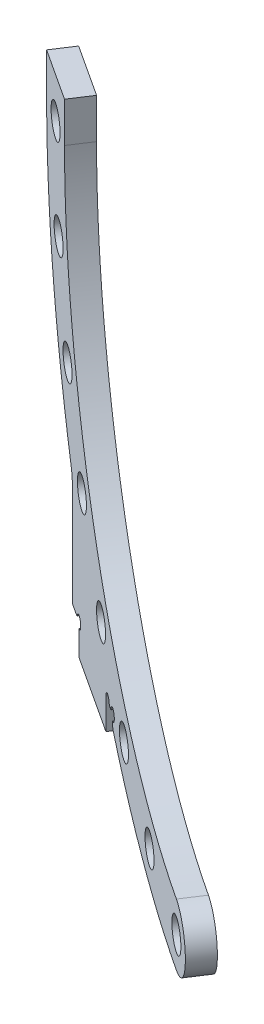
ISO-10303-21;
HEADER;
FILE_DESCRIPTION(('STEP AP214'),'2;1');
FILE_NAME('part.step','',(''),(''),'','','');
FILE_SCHEMA(('AUTOMOTIVE_DESIGN { 1 0 10303 214 1 1 1 1 }'));
ENDSEC;
DATA;
#1=APPLICATION_CONTEXT('core data for automotive mechanical design processes');
#2=APPLICATION_PROTOCOL_DEFINITION('international standard','automotive_design',2000,#1);
#3=PRODUCT_CONTEXT('',#1,'mechanical');
#4=PRODUCT('Part','Part','',(#3));
#5=PRODUCT_RELATED_PRODUCT_CATEGORY('part','',(#4));
#6=PRODUCT_DEFINITION_FORMATION('','',#4);
#7=PRODUCT_DEFINITION_CONTEXT('part definition',#1,'design');
#8=PRODUCT_DEFINITION('design','',#6,#7);
#9=PRODUCT_DEFINITION_SHAPE('','',#8);
#10=(LENGTH_UNIT() NAMED_UNIT(*) SI_UNIT(.MILLI.,.METRE.));
#11=(NAMED_UNIT(*) PLANE_ANGLE_UNIT() SI_UNIT($,.RADIAN.));
#12=(NAMED_UNIT(*) SI_UNIT($,.STERADIAN.) SOLID_ANGLE_UNIT());
#13=UNCERTAINTY_MEASURE_WITH_UNIT(LENGTH_MEASURE(1.E-05),#10,'distance_accuracy_value','');
#14=(GEOMETRIC_REPRESENTATION_CONTEXT(3) GLOBAL_UNCERTAINTY_ASSIGNED_CONTEXT((#13)) GLOBAL_UNIT_ASSIGNED_CONTEXT((#10,
#11,#12)) REPRESENTATION_CONTEXT('',''));
#15=CARTESIAN_POINT('',(0.,0.,0.));
#16=DIRECTION('',(0.,0.,1.));
#17=DIRECTION('',(1.,0.,0.));
#18=AXIS2_PLACEMENT_3D('',#15,#16,#17);
#19=CARTESIAN_POINT('',(27.833334942382,-26.,6.76462833423938));
#20=DIRECTION('',(0.547038860668516,0.,-0.837107212320197));
#21=DIRECTION('',(-0.837107212320197,0.,-0.547038860668516));
#22=AXIS2_PLACEMENT_3D('',#19,#20,#21);
#23=PLANE('',#22);
#24=CARTESIAN_POINT('',(27.833334942382,28.,6.76462833423938));
#25=DIRECTION('',(0.547038860668516,0.,-0.837107212320197));
#26=DIRECTION('',(-0.837107212320197,0.,-0.547038860668516));
#27=AXIS2_PLACEMENT_3D('',#24,#25,#26);
#28=CIRCLE('',#27,58.);
#29=CARTESIAN_POINT('',(27.833334942382,-30.,6.76462833423939));
#30=VERTEX_POINT('',#29);
#31=CARTESIAN_POINT('',(4.19051558919937,-22.6587202338135,-8.6856518349027));
#32=VERTEX_POINT('',#31);
#33=EDGE_CURVE('E214',#30,#32,#28,.T.);
#34=ORIENTED_EDGE('',*,*,#33,.T.);
#35=CARTESIAN_POINT('',(4.39433299741646,-22.2220071283496,-8.55245976447906));
#36=DIRECTION('',(0.547038860668516,0.,-0.837107212320197));
#37=DIRECTION('',(-0.837107212320197,0.,-0.547038860668516));
#38=AXIS2_PLACEMENT_3D('',#35,#36,#37);
#39=CIRCLE('',#38,0.5);
#40=CARTESIAN_POINT('',(3.97577939125636,-22.2220071283496,-8.82597919481332));
#41=VERTEX_POINT('',#40);
#42=EDGE_CURVE('E310',#32,#41,#39,.T.);
#43=ORIENTED_EDGE('',*,*,#42,.T.);
#44=DIRECTION('',(0.,1.,0.));
#45=VECTOR('',#44,1.);
#46=CARTESIAN_POINT('',(3.97577939125636,-21.,-8.82597919481332));
#47=LINE('',#46,#45);
#48=CARTESIAN_POINT('',(3.97577939125636,-21.75,-8.82597919481332));
#49=VERTEX_POINT('',#48);
#50=EDGE_CURVE('E200',#41,#49,#47,.T.);
#51=ORIENTED_EDGE('',*,*,#50,.T.);
#52=CARTESIAN_POINT('',(3.97577939125636,-21.,-8.82597919481332));
#53=DIRECTION('',(0.547038860668516,0.,-0.837107212320198));
#54=DIRECTION('',(-0.837107212320198,0.,-0.547038860668516));
#55=AXIS2_PLACEMENT_3D('',#52,#53,#54);
#56=CIRCLE('',#55,0.750000000000001);
#57=CARTESIAN_POINT('',(3.34794898201621,-21.,-9.23625834031471));
#58=VERTEX_POINT('',#57);
#59=EDGE_CURVE('E182',#58,#49,#56,.T.);
#60=ORIENTED_EDGE('',*,*,#59,.F.);
#61=DIRECTION('',(-0.837107212320198,0.,-0.547038860668515));
#62=VECTOR('',#61,1.);
#63=CARTESIAN_POINT('',(3.97577939125636,-21.,-8.82597919481332));
#64=LINE('',#63,#62);
#65=CARTESIAN_POINT('',(2.72011857277607,-21.,-9.6465374858161));
#66=VERTEX_POINT('',#65);
#67=EDGE_CURVE('E198',#58,#66,#64,.T.);
#68=ORIENTED_EDGE('',*,*,#67,.T.);
#69=CARTESIAN_POINT('',(2.09228816353592,-21.,-10.0568166313175));
#70=DIRECTION('',(0.547038860668516,0.,-0.837107212320198));
#71=DIRECTION('',(-0.837107212320198,0.,-0.547038860668516));
#72=AXIS2_PLACEMENT_3D('',#69,#70,#71);
#73=CIRCLE('',#72,0.750000000000001);
#74=CARTESIAN_POINT('',(1.46445775429577,-21.,-10.4670957768189));
#75=VERTEX_POINT('',#74);
#76=EDGE_CURVE('E202',#75,#66,#73,.T.);
#77=ORIENTED_EDGE('',*,*,#76,.F.);
#78=DIRECTION('',(0.,-1.,0.));
#79=VECTOR('',#78,1.);
#80=CARTESIAN_POINT('',(1.46445775429577,-21.,-10.4670957768189));
#81=LINE('',#80,#79);
#82=CARTESIAN_POINT('',(1.46445775429577,-25.,-10.4670957768189));
#83=VERTEX_POINT('',#82);
#84=EDGE_CURVE('E208',#75,#83,#81,.T.);
#85=ORIENTED_EDGE('',*,*,#84,.T.);
#86=DIRECTION('',(-0.837107212320198,0.,-0.547038860668516));
#87=VECTOR('',#86,1.);
#88=CARTESIAN_POINT('',(1.46445775429577,-25.,-10.4670957768189));
#89=LINE('',#88,#87);
#90=CARTESIAN_POINT('',(-8.5808287935466,-25.,-17.0315621048411));
#91=VERTEX_POINT('',#90);
#92=EDGE_CURVE('E212',#83,#91,#89,.T.);
#93=ORIENTED_EDGE('',*,*,#92,.T.);
#94=DIRECTION('',(0.,1.,0.));
#95=VECTOR('',#94,1.);
#96=CARTESIAN_POINT('',(-8.5808287935466,-25.,-17.0315621048411));
#97=LINE('',#96,#95);
#98=CARTESIAN_POINT('',(-8.5808287935466,-21.75,-17.0315621048411));
#99=VERTEX_POINT('',#98);
#100=EDGE_CURVE('E220',#91,#99,#97,.T.);
#101=ORIENTED_EDGE('',*,*,#100,.T.);
#102=CARTESIAN_POINT('',(-8.5808287935466,-21.,-17.0315621048411));
#103=DIRECTION('',(0.547038860668516,0.,-0.837107212320198));
#104=DIRECTION('',(-0.837107212320198,0.,-0.547038860668516));
#105=AXIS2_PLACEMENT_3D('',#102,#103,#104);
#106=CIRCLE('',#105,0.750000000000003);
#107=CARTESIAN_POINT('',(-9.15624486833422,-20.7,-17.4075891529054));
#108=VERTEX_POINT('',#107);
#109=EDGE_CURVE('E615',#108,#99,#106,.T.);
#110=ORIENTED_EDGE('',*,*,#109,.F.);
#111=CARTESIAN_POINT('',(-9.5398555848593,-20.5,-17.658273851615));
#112=DIRECTION('',(0.547038860668516,0.,-0.837107212320197));
#113=DIRECTION('',(-0.837107212320197,0.,-0.547038860668516));
#114=AXIS2_PLACEMENT_3D('',#111,#112,#113);
#115=CIRCLE('',#114,0.5);
#116=CARTESIAN_POINT('',(-9.5398555848593,-21.,-17.658273851615));
#117=VERTEX_POINT('',#116);
#118=EDGE_CURVE('E307',#108,#117,#115,.T.);
#119=ORIENTED_EDGE('',*,*,#118,.T.);
#120=DIRECTION('',(-0.837107212320198,0.,-0.547038860668516));
#121=VECTOR('',#120,1.);
#122=CARTESIAN_POINT('',(-8.5808287935466,-21.,-17.0315621048411));
#123=LINE('',#122,#121);
#124=CARTESIAN_POINT('',(-11.0921504305072,-21.,-18.6726786868466));
#125=VERTEX_POINT('',#124);
#126=EDGE_CURVE('E224',#117,#125,#123,.T.);
#127=ORIENTED_EDGE('',*,*,#126,.T.);
#128=DIRECTION('',(0.,1.,0.));
#129=VECTOR('',#128,1.);
#130=CARTESIAN_POINT('',(-11.0921504305072,-21.,-18.6726786868466));
#131=LINE('',#130,#129);
#132=CARTESIAN_POINT('',(-11.0921504305072,-7.64758056306205,-18.6726786868466));
#133=VERTEX_POINT('',#132);
#134=EDGE_CURVE('E227',#125,#133,#131,.T.);
#135=ORIENTED_EDGE('',*,*,#134,.T.);
#136=CARTESIAN_POINT('',(-13.6034720674678,-7.64758056306205,-20.3137952688522));
#137=DIRECTION('',(0.547038860668516,0.,-0.837107212320197));
#138=DIRECTION('',(-0.837107212320197,0.,-0.547038860668516));
#139=AXIS2_PLACEMENT_3D('',#136,#137,#138);
#140=CIRCLE('',#139,3.);
#141=CARTESIAN_POINT('',(-11.565596312885,-5.89442086323934,-18.9820695178804));
#142=VERTEX_POINT('',#141);
#143=EDGE_CURVE('E11',#133,#142,#140,.F.);
#144=ORIENTED_EDGE('',*,*,#143,.T.);
#145=CARTESIAN_POINT('',(27.833334942382,28.,6.76462833423938));
#146=DIRECTION('',(0.547038860668516,0.,-0.837107212320197));
#147=DIRECTION('',(-0.837107212320197,0.,-0.547038860668516));
#148=AXIS2_PLACEMENT_3D('',#145,#146,#147);
#149=CIRCLE('',#148,58.);
#150=CARTESIAN_POINT('',(-20.7188833721895,28.,-24.9636255845345));
#151=VERTEX_POINT('',#150);
#152=EDGE_CURVE('E230',#142,#151,#149,.T.);
#153=ORIENTED_EDGE('',*,*,#152,.T.);
#154=DIRECTION('',(0.,1.,0.));
#155=VECTOR('',#154,1.);
#156=CARTESIAN_POINT('',(-20.7188833721895,33.2,-24.9636255845345));
#157=LINE('',#156,#155);
#158=CARTESIAN_POINT('',(-20.7188833721895,33.2,-24.9636255845345));
#159=VERTEX_POINT('',#158);
#160=EDGE_CURVE('E233',#151,#159,#157,.T.);
#161=ORIENTED_EDGE('',*,*,#160,.T.);
#162=DIRECTION('',(0.837107212320197,0.,0.547038860668516));
#163=VECTOR('',#162,1.);
#164=CARTESIAN_POINT('',(-14.0220256736279,33.2,-20.5873146991864));
#165=LINE('',#164,#163);
#166=CARTESIAN_POINT('',(-14.0220256736279,33.2,-20.5873146991864));
#167=VERTEX_POINT('',#166);
#168=EDGE_CURVE('E236',#159,#167,#165,.T.);
#169=ORIENTED_EDGE('',*,*,#168,.T.);
#170=DIRECTION('',(0.,-1.,0.));
#171=VECTOR('',#170,1.);
#172=CARTESIAN_POINT('',(-14.0220256736279,28.,-20.5873146991864));
#173=LINE('',#172,#171);
#174=CARTESIAN_POINT('',(-14.0220256736279,28.,-20.5873146991864));
#175=VERTEX_POINT('',#174);
#176=EDGE_CURVE('E239',#167,#175,#173,.T.);
#177=ORIENTED_EDGE('',*,*,#176,.T.);
#178=CARTESIAN_POINT('',(27.833334942382,28.,6.76462833423938));
#179=DIRECTION('',(-0.547038860668516,0.,0.837107212320197));
#180=DIRECTION('',(0.837107212320197,0.,0.547038860668516));
#181=AXIS2_PLACEMENT_3D('',#178,#179,#180);
#182=CIRCLE('',#181,50.);
#183=CARTESIAN_POINT('',(27.833334942382,-22.,6.76462833423938));
#184=VERTEX_POINT('',#183);
#185=EDGE_CURVE('E242',#175,#184,#182,.T.);
#186=ORIENTED_EDGE('',*,*,#185,.T.);
#187=CARTESIAN_POINT('',(27.833334942382,-26.,6.76462833423938));
#188=DIRECTION('',(0.547038860668516,0.,-0.837107212320197));
#189=DIRECTION('',(-0.837107212320197,0.,-0.547038860668516));
#190=AXIS2_PLACEMENT_3D('',#187,#188,#189);
#191=CIRCLE('',#190,4.);
#192=EDGE_CURVE('E394',#184,#30,#191,.T.);
#193=ORIENTED_EDGE('',*,*,#192,.T.);
#194=EDGE_LOOP('',(#34,#43,#51,#60,#68,#77,#85,#93,#101,#110,#119,#127,#135,#144,#153,#161,#169,
#177,#186,#193));
#195=FACE_BOUND('',#194,.T.);
#196=CARTESIAN_POINT('',(17.7745454922009,-24.6461072578185,0.191338032176145));
#197=DIRECTION('',(0.547038860668516,0.,-0.837107212320197));
#198=DIRECTION('',(-0.837107212320197,0.,-0.547038860668516));
#199=AXIS2_PLACEMENT_3D('',#196,#197,#198);
#200=CIRCLE('',#199,2.);
#201=CARTESIAN_POINT('',(16.1003310675605,-24.6461072578185,-0.902739689160889));
#202=VERTEX_POINT('',#201);
#203=EDGE_CURVE('E366',#202,#202,#200,.T.);
#204=ORIENTED_EDGE('',*,*,#203,.F.);
#205=EDGE_LOOP('',(#204));
#206=FACE_BOUND('',#205,.T.);
#207=CARTESIAN_POINT('',(-0.350766794595995,-14.2189000532736,-11.6533218115116));
#208=DIRECTION('',(0.547038860668516,0.,-0.837107212320197));
#209=DIRECTION('',(-0.837107212320197,0.,-0.547038860668516));
#210=AXIS2_PLACEMENT_3D('',#207,#208,#209);
#211=CIRCLE('',#210,2.);
#212=CARTESIAN_POINT('',(-2.02498121923639,-14.2189000532736,-12.7473995328486));
#213=VERTEX_POINT('',#212);
#214=EDGE_CURVE('E374',#213,#213,#211,.T.);
#215=ORIENTED_EDGE('',*,*,#214,.F.);
#216=EDGE_LOOP('',(#215));
#217=FACE_BOUND('',#216,.T.);
#218=CARTESIAN_POINT('',(-12.8938720770602,4.57027808765185,-19.8500807474983));
#219=DIRECTION('',(0.547038860668516,0.,-0.837107212320197));
#220=DIRECTION('',(-0.837107212320197,0.,-0.547038860668516));
#221=AXIS2_PLACEMENT_3D('',#218,#219,#220);
#222=CIRCLE('',#221,2.00000000000001);
#223=CARTESIAN_POINT('',(-14.5680865017006,4.57027808765185,-20.9441584688353));
#224=VERTEX_POINT('',#223);
#225=EDGE_CURVE('E382',#224,#224,#222,.T.);
#226=ORIENTED_EDGE('',*,*,#225,.F.);
#227=EDGE_LOOP('',(#226));
#228=FACE_BOUND('',#227,.T.);
#229=CARTESIAN_POINT('',(-17.3704545229087,28.,-22.7754701418605));
#230=DIRECTION('',(0.547038860668516,0.,-0.837107212320197));
#231=DIRECTION('',(-0.837107212320197,0.,-0.547038860668516));
#232=AXIS2_PLACEMENT_3D('',#229,#230,#231);
#233=CIRCLE('',#232,2.);
#234=CARTESIAN_POINT('',(-19.0446689475491,28.,-23.8695478631975));
#235=VERTEX_POINT('',#234);
#236=EDGE_CURVE('E390',#235,#235,#233,.T.);
#237=ORIENTED_EDGE('',*,*,#236,.F.);
#238=EDGE_LOOP('',(#237));
#239=FACE_BOUND('',#238,.T.);
#240=CARTESIAN_POINT('',(-16.2371011437205,15.983869566359,-22.0348381987101));
#241=DIRECTION('',(0.547038860668516,0.,-0.837107212320197));
#242=DIRECTION('',(-0.837107212320197,0.,-0.547038860668516));
#243=AXIS2_PLACEMENT_3D('',#240,#241,#242);
#244=CIRCLE('',#243,2.);
#245=CARTESIAN_POINT('',(-17.9113155683609,15.983869566359,-23.1289159200472));
#246=VERTEX_POINT('',#245);
#247=EDGE_CURVE('E386',#246,#246,#244,.T.);
#248=ORIENTED_EDGE('',*,*,#247,.F.);
#249=EDGE_LOOP('',(#248));
#250=FACE_BOUND('',#249,.T.);
#251=CARTESIAN_POINT('',(-7.50841078843891,-5.66844930037162,-16.3307506495814));
#252=DIRECTION('',(0.547038860668516,0.,-0.837107212320197));
#253=DIRECTION('',(-0.837107212320197,0.,-0.547038860668516));
#254=AXIS2_PLACEMENT_3D('',#251,#252,#253);
#255=CIRCLE('',#254,2.00000000000001);
#256=CARTESIAN_POINT('',(-9.18262521307932,-5.66844930037162,-17.4248283709184));
#257=VERTEX_POINT('',#256);
#258=EDGE_CURVE('E378',#257,#257,#255,.T.);
#259=ORIENTED_EDGE('',*,*,#258,.F.);
#260=EDGE_LOOP('',(#259));
#261=FACE_BOUND('',#260,.T.);
#262=CARTESIAN_POINT('',(8.22014574689879,-20.6523188667306,-6.0523400464717));
#263=DIRECTION('',(0.547038860668516,0.,-0.837107212320197));
#264=DIRECTION('',(-0.837107212320197,0.,-0.547038860668516));
#265=AXIS2_PLACEMENT_3D('',#262,#263,#264);
#266=CIRCLE('',#265,2.);
#267=CARTESIAN_POINT('',(6.54593132225839,-20.6523188667306,-7.14641776780874));
#268=VERTEX_POINT('',#267);
#269=EDGE_CURVE('E370',#268,#268,#266,.T.);
#270=ORIENTED_EDGE('',*,*,#269,.F.);
#271=EDGE_LOOP('',(#270));
#272=FACE_BOUND('',#271,.T.);
#273=CARTESIAN_POINT('',(27.833334942382,-26.,6.76462833423938));
#274=DIRECTION('',(0.547038860668516,0.,-0.837107212320197));
#275=DIRECTION('',(-0.837107212320197,0.,-0.547038860668516));
#276=AXIS2_PLACEMENT_3D('',#273,#274,#275);
#277=CIRCLE('',#276,2.);
#278=CARTESIAN_POINT('',(26.1591205177416,-26.,5.67055061290235));
#279=VERTEX_POINT('',#278);
#280=EDGE_CURVE('E362',#279,#279,#277,.T.);
#281=ORIENTED_EDGE('',*,*,#280,.F.);
#282=EDGE_LOOP('',(#281));
#283=FACE_BOUND('',#282,.T.);
#284=ADVANCED_FACE('F40',(#195,#206,#217,#228,#239,#250,#261,#272,#283),#23,.T.);
#285=CARTESIAN_POINT('',(27.833334942382,-26.,6.76462833423938));
#286=DIRECTION('',(-0.547038860668516,0.,0.837107212320197));
#287=DIRECTION('',(0.837107212320197,0.,0.547038860668516));
#288=AXIS2_PLACEMENT_3D('',#285,#286,#287);
#289=CYLINDRICAL_SURFACE('',#288,4.);
#290=DIRECTION('',(-0.547038860668516,0.,0.837107212320197));
#291=VECTOR('',#290,1.);
#292=CARTESIAN_POINT('',(27.833334942382,-22.,6.76462833423938));
#293=LINE('',#292,#291);
#294=CARTESIAN_POINT('',(26.1922183603764,-22.,9.27594997119997));
#295=VERTEX_POINT('',#294);
#296=EDGE_CURVE('E245',#184,#295,#293,.T.);
#297=ORIENTED_EDGE('',*,*,#296,.T.);
#298=CARTESIAN_POINT('',(26.1922183603764,-26.,9.27594997119997));
#299=DIRECTION('',(0.547038860668516,0.,-0.837107212320197));
#300=DIRECTION('',(-0.837107212320197,0.,-0.547038860668516));
#301=AXIS2_PLACEMENT_3D('',#298,#299,#300);
#302=CIRCLE('',#301,4.);
#303=CARTESIAN_POINT('',(26.1922183603765,-30.,9.27594997119998));
#304=VERTEX_POINT('',#303);
#305=EDGE_CURVE('E418',#295,#304,#302,.T.);
#306=ORIENTED_EDGE('',*,*,#305,.T.);
#307=DIRECTION('',(-0.547038860668516,0.,0.837107212320197));
#308=VECTOR('',#307,1.);
#309=CARTESIAN_POINT('',(27.833334942382,-30.,6.76462833423939));
#310=LINE('',#309,#308);
#311=EDGE_CURVE('E281',#30,#304,#310,.T.);
#312=ORIENTED_EDGE('',*,*,#311,.F.);
#313=ORIENTED_EDGE('',*,*,#192,.F.);
#314=EDGE_LOOP('',(#297,#306,#312,#313));
#315=FACE_BOUND('',#314,.T.);
#316=ADVANCED_FACE('F447',(#315),#289,.T.);
#317=CARTESIAN_POINT('',(27.833334942382,28.,6.76462833423938));
#318=DIRECTION('',(-0.547038860668516,0.,0.837107212320197));
#319=DIRECTION('',(0.837107212320197,0.,0.547038860668516));
#320=AXIS2_PLACEMENT_3D('',#317,#318,#319);
#321=CYLINDRICAL_SURFACE('',#320,58.);
#322=CARTESIAN_POINT('',(26.1922183603764,28.,9.27594997119997));
#323=DIRECTION('',(0.547038860668516,0.,-0.837107212320197));
#324=DIRECTION('',(-0.837107212320197,0.,-0.547038860668516));
#325=AXIS2_PLACEMENT_3D('',#322,#323,#324);
#326=CIRCLE('',#325,58.);
#327=CARTESIAN_POINT('',(2.54939900719382,-22.6587202338135,-6.1743301979421));
#328=VERTEX_POINT('',#327);
#329=EDGE_CURVE('E412',#304,#328,#326,.T.);
#330=ORIENTED_EDGE('',*,*,#329,.T.);
#331=DIRECTION('',(-0.547038860668516,0.,0.837107212320197));
#332=VECTOR('',#331,1.);
#333=CARTESIAN_POINT('',(4.19051558919937,-22.6587202338135,-8.6856518349027));
#334=LINE('',#333,#332);
#335=EDGE_CURVE('E304',#328,#32,#334,.F.);
#336=ORIENTED_EDGE('',*,*,#335,.T.);
#337=ORIENTED_EDGE('',*,*,#33,.F.);
#338=ORIENTED_EDGE('',*,*,#311,.T.);
#339=EDGE_LOOP('',(#330,#336,#337,#338));
#340=FACE_BOUND('',#339,.T.);
#341=ADVANCED_FACE('F454',(#340),#321,.T.);
#342=CARTESIAN_POINT('',(3.97577939125636,-21.,-8.82597919481332));
#343=DIRECTION('',(0.837107212320197,0.,0.547038860668516));
#344=DIRECTION('',(0.547038860668516,0.,-0.837107212320197));
#345=AXIS2_PLACEMENT_3D('',#342,#343,#344);
#346=PLANE('',#345);
#347=ORIENTED_EDGE('',*,*,#50,.F.);
#348=DIRECTION('',(-0.547038860668516,0.,0.837107212320197));
#349=VECTOR('',#348,1.);
#350=CARTESIAN_POINT('',(3.97577939125636,-22.2220071283496,-8.82597919481332));
#351=LINE('',#350,#349);
#352=CARTESIAN_POINT('',(2.33466280925081,-22.2220071283496,-6.31465755785273));
#353=VERTEX_POINT('',#352);
#354=EDGE_CURVE('E294',#41,#353,#351,.T.);
#355=ORIENTED_EDGE('',*,*,#354,.T.);
#356=DIRECTION('',(0.,1.,0.));
#357=VECTOR('',#356,1.);
#358=CARTESIAN_POINT('',(2.33466280925081,-21.,-6.31465755785273));
#359=LINE('',#358,#357);
#360=CARTESIAN_POINT('',(2.33466280925081,-21.75,-6.31465755785273));
#361=VERTEX_POINT('',#360);
#362=EDGE_CURVE('E408',#353,#361,#359,.T.);
#363=ORIENTED_EDGE('',*,*,#362,.T.);
#364=DIRECTION('',(0.547038860668516,0.,-0.837107212320197));
#365=VECTOR('',#364,1.);
#366=CARTESIAN_POINT('',(-13.1966844882427,-21.75,17.4522149160573));
#367=LINE('',#366,#365);
#368=EDGE_CURVE('E191',#361,#49,#367,.T.);
#369=ORIENTED_EDGE('',*,*,#368,.T.);
#370=EDGE_LOOP('',(#347,#355,#363,#369));
#371=FACE_BOUND('',#370,.T.);
#372=ADVANCED_FACE('F407',(#371),#346,.F.);
#373=CARTESIAN_POINT('',(3.97577939125636,-21.,-8.82597919481332));
#374=DIRECTION('',(0.,1.,0.));
#375=DIRECTION('',(-1.,0.,0.));
#376=AXIS2_PLACEMENT_3D('',#373,#374,#375);
#377=PLANE('',#376);
#378=DIRECTION('',(-0.837107212320198,0.,-0.547038860668515));
#379=VECTOR('',#378,1.);
#380=CARTESIAN_POINT('',(2.33466280925081,-21.,-6.31465755785273));
#381=LINE('',#380,#379);
#382=CARTESIAN_POINT('',(1.70683240001066,-21.,-6.72493670335412));
#383=VERTEX_POINT('',#382);
#384=CARTESIAN_POINT('',(1.07900199077052,-21.,-7.1352158488555));
#385=VERTEX_POINT('',#384);
#386=EDGE_CURVE('E411',#383,#385,#381,.T.);
#387=ORIENTED_EDGE('',*,*,#386,.T.);
#388=DIRECTION('',(0.547038860668516,0.,-0.837107212320197));
#389=VECTOR('',#388,1.);
#390=CARTESIAN_POINT('',(-14.452345306723,-21.,16.6316566250545));
#391=LINE('',#390,#389);
#392=EDGE_CURVE('E206',#385,#66,#391,.T.);
#393=ORIENTED_EDGE('',*,*,#392,.T.);
#394=ORIENTED_EDGE('',*,*,#67,.F.);
#395=DIRECTION('',(0.547038860668516,0.,-0.837107212320197));
#396=VECTOR('',#395,1.);
#397=CARTESIAN_POINT('',(-13.8245148974829,-21.,17.0419357705559));
#398=LINE('',#397,#396);
#399=EDGE_CURVE('E178',#58,#383,#398,.F.);
#400=ORIENTED_EDGE('',*,*,#399,.T.);
#401=EDGE_LOOP('',(#387,#393,#394,#400));
#402=FACE_BOUND('',#401,.T.);
#403=ADVANCED_FACE('F205',(#402),#377,.F.);
#404=CARTESIAN_POINT('',(1.46445775429577,-21.,-10.4670957768189));
#405=DIRECTION('',(-0.837107212320197,0.,-0.547038860668516));
#406=DIRECTION('',(-0.547038860668516,0.,0.837107212320197));
#407=AXIS2_PLACEMENT_3D('',#404,#405,#406);
#408=PLANE('',#407);
#409=DIRECTION('',(-0.547038860668516,0.,0.837107212320197));
#410=VECTOR('',#409,1.);
#411=CARTESIAN_POINT('',(1.46445775429577,-21.,-10.4670957768189));
#412=LINE('',#411,#410);
#413=CARTESIAN_POINT('',(-0.17665882770978,-21.,-7.95577413985828));
#414=VERTEX_POINT('',#413);
#415=EDGE_CURVE('E277',#75,#414,#412,.T.);
#416=ORIENTED_EDGE('',*,*,#415,.T.);
#417=DIRECTION('',(0.,-1.,0.));
#418=VECTOR('',#417,1.);
#419=CARTESIAN_POINT('',(-0.176658827709779,-21.,-7.95577413985828));
#420=LINE('',#419,#418);
#421=CARTESIAN_POINT('',(-0.176658827709776,-25.,-7.95577413985827));
#422=VERTEX_POINT('',#421);
#423=EDGE_CURVE('E416',#414,#422,#420,.T.);
#424=ORIENTED_EDGE('',*,*,#423,.T.);
#425=DIRECTION('',(-0.547038860668516,0.,0.837107212320197));
#426=VECTOR('',#425,1.);
#427=CARTESIAN_POINT('',(1.46445775429577,-25.,-10.4670957768189));
#428=LINE('',#427,#426);
#429=EDGE_CURVE('E273',#83,#422,#428,.T.);
#430=ORIENTED_EDGE('',*,*,#429,.F.);
#431=ORIENTED_EDGE('',*,*,#84,.F.);
#432=EDGE_LOOP('',(#416,#424,#430,#431));
#433=FACE_BOUND('',#432,.T.);
#434=ADVANCED_FACE('F489',(#433),#408,.F.);
#435=CARTESIAN_POINT('',(1.46445775429577,-25.,-10.4670957768189));
#436=DIRECTION('',(0.,1.,0.));
#437=DIRECTION('',(0.,0.,1.));
#438=AXIS2_PLACEMENT_3D('',#435,#436,#437);
#439=PLANE('',#438);
#440=ORIENTED_EDGE('',*,*,#429,.T.);
#441=DIRECTION('',(-0.837107212320198,0.,-0.547038860668516));
#442=VECTOR('',#441,1.);
#443=CARTESIAN_POINT('',(-0.176658827709776,-25.,-7.95577413985827));
#444=LINE('',#443,#442);
#445=CARTESIAN_POINT('',(-10.2219453755521,-25.,-14.5202404678805));
#446=VERTEX_POINT('',#445);
#447=EDGE_CURVE('E425',#422,#446,#444,.T.);
#448=ORIENTED_EDGE('',*,*,#447,.T.);
#449=DIRECTION('',(-0.547038860668516,0.,0.837107212320197));
#450=VECTOR('',#449,1.);
#451=CARTESIAN_POINT('',(-8.5808287935466,-25.,-17.0315621048411));
#452=LINE('',#451,#450);
#453=EDGE_CURVE('E269',#91,#446,#452,.T.);
#454=ORIENTED_EDGE('',*,*,#453,.F.);
#455=ORIENTED_EDGE('',*,*,#92,.F.);
#456=EDGE_LOOP('',(#440,#448,#454,#455));
#457=FACE_BOUND('',#456,.T.);
#458=ADVANCED_FACE('F485',(#457),#439,.F.);
#459=CARTESIAN_POINT('',(-8.5808287935466,-25.,-17.0315621048411));
#460=DIRECTION('',(0.837107212320197,0.,0.547038860668516));
#461=DIRECTION('',(0.547038860668516,0.,-0.837107212320197));
#462=AXIS2_PLACEMENT_3D('',#459,#460,#461);
#463=PLANE('',#462);
#464=DIRECTION('',(0.,1.,0.));
#465=VECTOR('',#464,1.);
#466=CARTESIAN_POINT('',(-10.2219453755521,-25.,-14.5202404678805));
#467=LINE('',#466,#465);
#468=CARTESIAN_POINT('',(-10.2219453755521,-21.75,-14.5202404678805));
#469=VERTEX_POINT('',#468);
#470=EDGE_CURVE('E429',#446,#469,#467,.T.);
#471=ORIENTED_EDGE('',*,*,#470,.T.);
#472=DIRECTION('',(0.547038860668516,0.,-0.837107212320197));
#473=VECTOR('',#472,1.);
#474=CARTESIAN_POINT('',(-25.7532926730457,-21.75,9.24663200602958));
#475=LINE('',#474,#473);
#476=EDGE_CURVE('E607',#469,#99,#475,.T.);
#477=ORIENTED_EDGE('',*,*,#476,.T.);
#478=ORIENTED_EDGE('',*,*,#100,.F.);
#479=ORIENTED_EDGE('',*,*,#453,.T.);
#480=EDGE_LOOP('',(#471,#477,#478,#479));
#481=FACE_BOUND('',#480,.T.);
#482=ADVANCED_FACE('F482',(#481),#463,.F.);
#483=CARTESIAN_POINT('',(-8.5808287935466,-21.,-17.0315621048411));
#484=DIRECTION('',(0.,1.,0.));
#485=DIRECTION('',(0.,0.,1.));
#486=AXIS2_PLACEMENT_3D('',#483,#484,#485);
#487=PLANE('',#486);
#488=ORIENTED_EDGE('',*,*,#126,.F.);
#489=DIRECTION('',(0.547038860668516,0.,-0.837107212320197));
#490=VECTOR('',#489,1.);
#491=CARTESIAN_POINT('',(-9.5398555848593,-21.,-17.658273851615));
#492=LINE('',#491,#490);
#493=CARTESIAN_POINT('',(-11.1809721668648,-21.,-15.1469522146544));
#494=VERTEX_POINT('',#493);
#495=EDGE_CURVE('E313',#117,#494,#492,.F.);
#496=ORIENTED_EDGE('',*,*,#495,.T.);
#497=DIRECTION('',(-0.837107212320198,0.,-0.547038860668516));
#498=VECTOR('',#497,1.);
#499=CARTESIAN_POINT('',(-10.2219453755521,-21.,-14.5202404678805));
#500=LINE('',#499,#498);
#501=CARTESIAN_POINT('',(-12.7332670125127,-21.,-16.161357049886));
#502=VERTEX_POINT('',#501);
#503=EDGE_CURVE('E347',#494,#502,#500,.T.);
#504=ORIENTED_EDGE('',*,*,#503,.T.);
#505=DIRECTION('',(-0.547038860668516,0.,0.837107212320197));
#506=VECTOR('',#505,1.);
#507=CARTESIAN_POINT('',(-11.0921504305072,-21.,-18.6726786868466));
#508=LINE('',#507,#506);
#509=EDGE_CURVE('E265',#125,#502,#508,.T.);
#510=ORIENTED_EDGE('',*,*,#509,.F.);
#511=EDGE_LOOP('',(#488,#496,#504,#510));
#512=FACE_BOUND('',#511,.T.);
#513=ADVANCED_FACE('F437',(#512),#487,.F.);
#514=CARTESIAN_POINT('',(-11.0921504305072,-21.,-18.6726786868466));
#515=DIRECTION('',(0.837107212320197,0.,0.547038860668516));
#516=DIRECTION('',(0.547038860668516,0.,-0.837107212320197));
#517=AXIS2_PLACEMENT_3D('',#514,#515,#516);
#518=PLANE('',#517);
#519=DIRECTION('',(0.,1.,0.));
#520=VECTOR('',#519,1.);
#521=CARTESIAN_POINT('',(-12.7332670125127,-21.,-16.161357049886));
#522=LINE('',#521,#520);
#523=CARTESIAN_POINT('',(-12.7332670125127,-7.64758056306205,-16.161357049886));
#524=VERTEX_POINT('',#523);
#525=EDGE_CURVE('E341',#502,#524,#522,.T.);
#526=ORIENTED_EDGE('',*,*,#525,.T.);
#527=DIRECTION('',(0.547038860668516,0.,-0.837107212320197));
#528=VECTOR('',#527,1.);
#529=CARTESIAN_POINT('',(-11.0921504305072,-7.64758056306205,-18.6726786868466));
#530=LINE('',#529,#528);
#531=EDGE_CURVE('E56',#524,#133,#530,.T.);
#532=ORIENTED_EDGE('',*,*,#531,.T.);
#533=ORIENTED_EDGE('',*,*,#134,.F.);
#534=ORIENTED_EDGE('',*,*,#509,.T.);
#535=EDGE_LOOP('',(#526,#532,#533,#534));
#536=FACE_BOUND('',#535,.T.);
#537=ADVANCED_FACE('F439',(#536),#518,.F.);
#538=CARTESIAN_POINT('',(27.833334942382,28.,6.76462833423938));
#539=DIRECTION('',(-0.547038860668516,0.,0.837107212320197));
#540=DIRECTION('',(0.837107212320197,0.,0.547038860668516));
#541=AXIS2_PLACEMENT_3D('',#538,#539,#540);
#542=CYLINDRICAL_SURFACE('',#541,58.);
#543=ORIENTED_EDGE('',*,*,#152,.F.);
#544=DIRECTION('',(-0.547038860668516,0.,0.837107212320197));
#545=VECTOR('',#544,1.);
#546=CARTESIAN_POINT('',(-11.565596312885,-5.89442086323934,-18.9820695178804));
#547=LINE('',#546,#545);
#548=CARTESIAN_POINT('',(-13.2067128948906,-5.89442086323933,-16.4707478809198));
#549=VERTEX_POINT('',#548);
#550=EDGE_CURVE('E320',#142,#549,#547,.T.);
#551=ORIENTED_EDGE('',*,*,#550,.T.);
#552=CARTESIAN_POINT('',(26.1922183603764,28.,9.27594997119997));
#553=DIRECTION('',(0.547038860668516,0.,-0.837107212320197));
#554=DIRECTION('',(-0.837107212320197,0.,-0.547038860668516));
#555=AXIS2_PLACEMENT_3D('',#552,#553,#554);
#556=CIRCLE('',#555,58.);
#557=CARTESIAN_POINT('',(-22.359999954195,28.,-22.4523039475739));
#558=VERTEX_POINT('',#557);
#559=EDGE_CURVE('E331',#549,#558,#556,.T.);
#560=ORIENTED_EDGE('',*,*,#559,.T.);
#561=DIRECTION('',(-0.547038860668516,0.,0.837107212320197));
#562=VECTOR('',#561,1.);
#563=CARTESIAN_POINT('',(-20.7188833721895,28.,-24.9636255845345));
#564=LINE('',#563,#562);
#565=EDGE_CURVE('E261',#151,#558,#564,.T.);
#566=ORIENTED_EDGE('',*,*,#565,.F.);
#567=EDGE_LOOP('',(#543,#551,#560,#566));
#568=FACE_BOUND('',#567,.T.);
#569=ADVANCED_FACE('F329',(#568),#542,.T.);
#570=CARTESIAN_POINT('',(-20.7188833721895,33.2,-24.9636255845345));
#571=DIRECTION('',(0.837107212320197,0.,0.547038860668516));
#572=DIRECTION('',(0.547038860668516,0.,-0.837107212320197));
#573=AXIS2_PLACEMENT_3D('',#570,#571,#572);
#574=PLANE('',#573);
#575=ORIENTED_EDGE('',*,*,#565,.T.);
#576=DIRECTION('',(0.,1.,0.));
#577=VECTOR('',#576,1.);
#578=CARTESIAN_POINT('',(-22.359999954195,33.2,-22.4523039475739));
#579=LINE('',#578,#577);
#580=CARTESIAN_POINT('',(-22.359999954195,33.2,-22.4523039475739));
#581=VERTEX_POINT('',#580);
#582=EDGE_CURVE('E339',#558,#581,#579,.T.);
#583=ORIENTED_EDGE('',*,*,#582,.T.);
#584=DIRECTION('',(-0.547038860668516,0.,0.837107212320197));
#585=VECTOR('',#584,1.);
#586=CARTESIAN_POINT('',(-20.7188833721895,33.2,-24.9636255845345));
#587=LINE('',#586,#585);
#588=EDGE_CURVE('E257',#159,#581,#587,.T.);
#589=ORIENTED_EDGE('',*,*,#588,.F.);
#590=ORIENTED_EDGE('',*,*,#160,.F.);
#591=EDGE_LOOP('',(#575,#583,#589,#590));
#592=FACE_BOUND('',#591,.T.);
#593=ADVANCED_FACE('F472',(#592),#574,.F.);
#594=CARTESIAN_POINT('',(-14.0220256736279,33.2,-20.5873146991864));
#595=DIRECTION('',(0.,-1.,0.));
#596=DIRECTION('',(0.,0.,-1.));
#597=AXIS2_PLACEMENT_3D('',#594,#595,#596);
#598=PLANE('',#597);
#599=ORIENTED_EDGE('',*,*,#588,.T.);
#600=DIRECTION('',(0.837107212320197,0.,0.547038860668516));
#601=VECTOR('',#600,1.);
#602=CARTESIAN_POINT('',(-15.6631422556334,33.2,-18.0759930622258));
#603=LINE('',#602,#601);
#604=CARTESIAN_POINT('',(-15.6631422556334,33.2,-18.0759930622258));
#605=VERTEX_POINT('',#604);
#606=EDGE_CURVE('E345',#581,#605,#603,.T.);
#607=ORIENTED_EDGE('',*,*,#606,.T.);
#608=DIRECTION('',(-0.547038860668516,0.,0.837107212320197));
#609=VECTOR('',#608,1.);
#610=CARTESIAN_POINT('',(-14.0220256736279,33.2,-20.5873146991864));
#611=LINE('',#610,#609);
#612=EDGE_CURVE('E253',#167,#605,#611,.T.);
#613=ORIENTED_EDGE('',*,*,#612,.F.);
#614=ORIENTED_EDGE('',*,*,#168,.F.);
#615=EDGE_LOOP('',(#599,#607,#613,#614));
#616=FACE_BOUND('',#615,.T.);
#617=ADVANCED_FACE('F468',(#616),#598,.F.);
#618=CARTESIAN_POINT('',(-14.0220256736279,28.,-20.5873146991864));
#619=DIRECTION('',(-0.837107212320197,0.,-0.547038860668516));
#620=DIRECTION('',(-0.547038860668516,0.,0.837107212320197));
#621=AXIS2_PLACEMENT_3D('',#618,#619,#620);
#622=PLANE('',#621);
#623=ORIENTED_EDGE('',*,*,#612,.T.);
#624=DIRECTION('',(0.,-1.,0.));
#625=VECTOR('',#624,1.);
#626=CARTESIAN_POINT('',(-15.6631422556334,28.,-18.0759930622258));
#627=LINE('',#626,#625);
#628=CARTESIAN_POINT('',(-15.6631422556334,28.,-18.0759930622258));
#629=VERTEX_POINT('',#628);
#630=EDGE_CURVE('E354',#605,#629,#627,.T.);
#631=ORIENTED_EDGE('',*,*,#630,.T.);
#632=DIRECTION('',(-0.547038860668516,0.,0.837107212320197));
#633=VECTOR('',#632,1.);
#634=CARTESIAN_POINT('',(-14.0220256736279,28.,-20.5873146991864));
#635=LINE('',#634,#633);
#636=EDGE_CURVE('E249',#175,#629,#635,.T.);
#637=ORIENTED_EDGE('',*,*,#636,.F.);
#638=ORIENTED_EDGE('',*,*,#176,.F.);
#639=EDGE_LOOP('',(#623,#631,#637,#638));
#640=FACE_BOUND('',#639,.T.);
#641=ADVANCED_FACE('F464',(#640),#622,.F.);
#642=CARTESIAN_POINT('',(27.833334942382,28.,6.76462833423938));
#643=DIRECTION('',(-0.547038860668516,0.,0.837107212320197));
#644=DIRECTION('',(0.837107212320197,0.,0.547038860668516));
#645=AXIS2_PLACEMENT_3D('',#642,#643,#644);
#646=CYLINDRICAL_SURFACE('',#645,50.);
#647=ORIENTED_EDGE('',*,*,#636,.T.);
#648=CARTESIAN_POINT('',(26.1922183603764,28.,9.27594997119997));
#649=DIRECTION('',(-0.547038860668516,0.,0.837107212320197));
#650=DIRECTION('',(0.837107212320197,0.,0.547038860668516));
#651=AXIS2_PLACEMENT_3D('',#648,#649,#650);
#652=CIRCLE('',#651,50.);
#653=EDGE_CURVE('E358',#629,#295,#652,.T.);
#654=ORIENTED_EDGE('',*,*,#653,.T.);
#655=ORIENTED_EDGE('',*,*,#296,.F.);
#656=ORIENTED_EDGE('',*,*,#185,.F.);
#657=EDGE_LOOP('',(#647,#654,#655,#656));
#658=FACE_BOUND('',#657,.T.);
#659=ADVANCED_FACE('F461',(#658),#646,.F.);
#660=CARTESIAN_POINT('',(-17.3704545229087,28.,-22.7754701418605));
#661=DIRECTION('',(-0.547038860668516,0.,0.837107212320197));
#662=DIRECTION('',(0.837107212320197,0.,0.547038860668516));
#663=AXIS2_PLACEMENT_3D('',#660,#661,#662);
#664=CYLINDRICAL_SURFACE('',#663,2.);
#665=CARTESIAN_POINT('',(-19.0115711049142,28.,-20.2641485048999));
#666=DIRECTION('',(0.547038860668516,0.,-0.837107212320197));
#667=DIRECTION('',(-0.837107212320197,0.,-0.547038860668516));
#668=AXIS2_PLACEMENT_3D('',#665,#666,#667);
#669=CIRCLE('',#668,2.);
#670=CARTESIAN_POINT('',(-20.6857855295546,28.,-21.3582262262369));
#671=VERTEX_POINT('',#670);
#672=EDGE_CURVE('E565',#671,#671,#669,.T.);
#673=ORIENTED_EDGE('',*,*,#672,.F.);
#674=EDGE_LOOP('',(#673));
#675=FACE_BOUND('',#674,.T.);
#676=ORIENTED_EDGE('',*,*,#236,.T.);
#677=EDGE_LOOP('',(#676));
#678=FACE_BOUND('',#677,.T.);
#679=ADVANCED_FACE('F459',(#675,#678),#664,.F.);
#680=CARTESIAN_POINT('',(-16.2371011437205,15.983869566359,-22.0348381987101));
#681=DIRECTION('',(-0.547038860668516,0.,0.837107212320197));
#682=DIRECTION('',(0.837107212320197,0.,0.547038860668516));
#683=AXIS2_PLACEMENT_3D('',#680,#681,#682);
#684=CYLINDRICAL_SURFACE('',#683,2.);
#685=CARTESIAN_POINT('',(-17.8782177257261,15.983869566359,-19.5235165617495));
#686=DIRECTION('',(0.547038860668516,0.,-0.837107212320197));
#687=DIRECTION('',(-0.837107212320197,0.,-0.547038860668516));
#688=AXIS2_PLACEMENT_3D('',#685,#686,#687);
#689=CIRCLE('',#688,2.);
#690=CARTESIAN_POINT('',(-19.5524321503665,15.983869566359,-20.6175942830866));
#691=VERTEX_POINT('',#690);
#692=EDGE_CURVE('E552',#691,#691,#689,.T.);
#693=ORIENTED_EDGE('',*,*,#692,.F.);
#694=EDGE_LOOP('',(#693));
#695=FACE_BOUND('',#694,.T.);
#696=ORIENTED_EDGE('',*,*,#247,.T.);
#697=EDGE_LOOP('',(#696));
#698=FACE_BOUND('',#697,.T.);
#699=ADVANCED_FACE('F541',(#695,#698),#684,.F.);
#700=CARTESIAN_POINT('',(-12.8938720770602,4.57027808765185,-19.8500807474983));
#701=DIRECTION('',(-0.547038860668516,0.,0.837107212320197));
#702=DIRECTION('',(0.837107212320197,0.,0.547038860668516));
#703=AXIS2_PLACEMENT_3D('',#700,#701,#702);
#704=CYLINDRICAL_SURFACE('',#703,2.00000000000001);
#705=CARTESIAN_POINT('',(-14.5349886590658,4.57027808765185,-17.3387591105377));
#706=DIRECTION('',(0.547038860668516,0.,-0.837107212320197));
#707=DIRECTION('',(-0.837107212320197,0.,-0.547038860668516));
#708=AXIS2_PLACEMENT_3D('',#705,#706,#707);
#709=CIRCLE('',#708,2.00000000000001);
#710=CARTESIAN_POINT('',(-16.2092030837062,4.57027808765185,-18.4328368318747));
#711=VERTEX_POINT('',#710);
#712=EDGE_CURVE('E566',#711,#711,#709,.T.);
#713=ORIENTED_EDGE('',*,*,#712,.F.);
#714=EDGE_LOOP('',(#713));
#715=FACE_BOUND('',#714,.T.);
#716=ORIENTED_EDGE('',*,*,#225,.T.);
#717=EDGE_LOOP('',(#716));
#718=FACE_BOUND('',#717,.T.);
#719=ADVANCED_FACE('F538',(#715,#718),#704,.F.);
#720=CARTESIAN_POINT('',(-7.50841078843891,-5.66844930037162,-16.3307506495814));
#721=DIRECTION('',(-0.547038860668516,0.,0.837107212320197));
#722=DIRECTION('',(0.837107212320197,0.,0.547038860668516));
#723=AXIS2_PLACEMENT_3D('',#720,#721,#722);
#724=CYLINDRICAL_SURFACE('',#723,2.00000000000001);
#725=CARTESIAN_POINT('',(-9.14952737044446,-5.66844930037162,-13.8194290126208));
#726=DIRECTION('',(0.547038860668516,0.,-0.837107212320197));
#727=DIRECTION('',(-0.837107212320197,0.,-0.547038860668516));
#728=AXIS2_PLACEMENT_3D('',#725,#726,#727);
#729=CIRCLE('',#728,2.00000000000001);
#730=CARTESIAN_POINT('',(-10.8237417950849,-5.66844930037162,-14.9135067339578));
#731=VERTEX_POINT('',#730);
#732=EDGE_CURVE('E573',#731,#731,#729,.T.);
#733=ORIENTED_EDGE('',*,*,#732,.F.);
#734=EDGE_LOOP('',(#733));
#735=FACE_BOUND('',#734,.T.);
#736=ORIENTED_EDGE('',*,*,#258,.T.);
#737=EDGE_LOOP('',(#736));
#738=FACE_BOUND('',#737,.T.);
#739=ADVANCED_FACE('F534',(#735,#738),#724,.F.);
#740=CARTESIAN_POINT('',(-0.350766794595995,-14.2189000532736,-11.6533218115116));
#741=DIRECTION('',(-0.547038860668516,0.,0.837107212320197));
#742=DIRECTION('',(0.837107212320197,0.,0.547038860668516));
#743=AXIS2_PLACEMENT_3D('',#740,#741,#742);
#744=CYLINDRICAL_SURFACE('',#743,2.);
#745=CARTESIAN_POINT('',(-1.99188337660154,-14.2189000532736,-9.142000174551));
#746=DIRECTION('',(0.547038860668516,0.,-0.837107212320197));
#747=DIRECTION('',(-0.837107212320197,0.,-0.547038860668516));
#748=AXIS2_PLACEMENT_3D('',#745,#746,#747);
#749=CIRCLE('',#748,2.);
#750=CARTESIAN_POINT('',(-3.66609780124194,-14.2189000532736,-10.236077895888));
#751=VERTEX_POINT('',#750);
#752=EDGE_CURVE('E589',#751,#751,#749,.T.);
#753=ORIENTED_EDGE('',*,*,#752,.F.);
#754=EDGE_LOOP('',(#753));
#755=FACE_BOUND('',#754,.T.);
#756=ORIENTED_EDGE('',*,*,#214,.T.);
#757=EDGE_LOOP('',(#756));
#758=FACE_BOUND('',#757,.T.);
#759=ADVANCED_FACE('F530',(#755,#758),#744,.F.);
#760=CARTESIAN_POINT('',(8.22014574689879,-20.6523188667306,-6.0523400464717));
#761=DIRECTION('',(-0.547038860668516,0.,0.837107212320197));
#762=DIRECTION('',(0.837107212320197,0.,0.547038860668516));
#763=AXIS2_PLACEMENT_3D('',#760,#761,#762);
#764=CYLINDRICAL_SURFACE('',#763,2.);
#765=CARTESIAN_POINT('',(6.57902916489325,-20.6523188667306,-3.54101840951111));
#766=DIRECTION('',(0.547038860668516,0.,-0.837107212320197));
#767=DIRECTION('',(-0.837107212320197,0.,-0.547038860668516));
#768=AXIS2_PLACEMENT_3D('',#765,#766,#767);
#769=CIRCLE('',#768,2.);
#770=CARTESIAN_POINT('',(4.90481474025285,-20.6523188667306,-4.63509613084814));
#771=VERTEX_POINT('',#770);
#772=EDGE_CURVE('E593',#771,#771,#769,.T.);
#773=ORIENTED_EDGE('',*,*,#772,.F.);
#774=EDGE_LOOP('',(#773));
#775=FACE_BOUND('',#774,.T.);
#776=ORIENTED_EDGE('',*,*,#269,.T.);
#777=EDGE_LOOP('',(#776));
#778=FACE_BOUND('',#777,.T.);
#779=ADVANCED_FACE('F526',(#775,#778),#764,.F.);
#780=CARTESIAN_POINT('',(17.7745454922009,-24.6461072578185,0.191338032176145));
#781=DIRECTION('',(-0.547038860668516,0.,0.837107212320197));
#782=DIRECTION('',(0.837107212320197,0.,0.547038860668516));
#783=AXIS2_PLACEMENT_3D('',#780,#781,#782);
#784=CYLINDRICAL_SURFACE('',#783,2.);
#785=CARTESIAN_POINT('',(16.1334289101954,-24.6461072578185,2.70265966913674));
#786=DIRECTION('',(0.547038860668516,0.,-0.837107212320197));
#787=DIRECTION('',(-0.837107212320197,0.,-0.547038860668516));
#788=AXIS2_PLACEMENT_3D('',#785,#786,#787);
#789=CIRCLE('',#788,2.);
#790=CARTESIAN_POINT('',(14.459214485555,-24.6461072578185,1.6085819477997));
#791=VERTEX_POINT('',#790);
#792=EDGE_CURVE('E597',#791,#791,#789,.T.);
#793=ORIENTED_EDGE('',*,*,#792,.F.);
#794=EDGE_LOOP('',(#793));
#795=FACE_BOUND('',#794,.T.);
#796=ORIENTED_EDGE('',*,*,#203,.T.);
#797=EDGE_LOOP('',(#796));
#798=FACE_BOUND('',#797,.T.);
#799=ADVANCED_FACE('F522',(#795,#798),#784,.F.);
#800=CARTESIAN_POINT('',(27.833334942382,-26.,6.76462833423938));
#801=DIRECTION('',(-0.547038860668516,0.,0.837107212320197));
#802=DIRECTION('',(0.837107212320197,0.,0.547038860668516));
#803=AXIS2_PLACEMENT_3D('',#800,#801,#802);
#804=CYLINDRICAL_SURFACE('',#803,2.);
#805=CARTESIAN_POINT('',(26.1922183603764,-26.,9.27594997119997));
#806=DIRECTION('',(0.547038860668516,0.,-0.837107212320197));
#807=DIRECTION('',(-0.837107212320197,0.,-0.547038860668516));
#808=AXIS2_PLACEMENT_3D('',#805,#806,#807);
#809=CIRCLE('',#808,2.);
#810=CARTESIAN_POINT('',(24.518003935736,-26.,8.18187224986294));
#811=VERTEX_POINT('',#810);
#812=EDGE_CURVE('E601',#811,#811,#809,.T.);
#813=ORIENTED_EDGE('',*,*,#812,.F.);
#814=EDGE_LOOP('',(#813));
#815=FACE_BOUND('',#814,.T.);
#816=ORIENTED_EDGE('',*,*,#280,.T.);
#817=EDGE_LOOP('',(#816));
#818=FACE_BOUND('',#817,.T.);
#819=ADVANCED_FACE('F518',(#815,#818),#804,.F.);
#820=CARTESIAN_POINT('',(26.1922183603764,-26.,9.27594997119997));
#821=DIRECTION('',(0.547038860668516,0.,-0.837107212320197));
#822=DIRECTION('',(-0.837107212320197,0.,-0.547038860668516));
#823=AXIS2_PLACEMENT_3D('',#820,#821,#822);
#824=PLANE('',#823);
#825=ORIENTED_EDGE('',*,*,#792,.T.);
#826=EDGE_LOOP('',(#825));
#827=FACE_BOUND('',#826,.T.);
#828=ORIENTED_EDGE('',*,*,#752,.T.);
#829=EDGE_LOOP('',(#828));
#830=FACE_BOUND('',#829,.T.);
#831=ORIENTED_EDGE('',*,*,#712,.T.);
#832=EDGE_LOOP('',(#831));
#833=FACE_BOUND('',#832,.T.);
#834=ORIENTED_EDGE('',*,*,#672,.T.);
#835=EDGE_LOOP('',(#834));
#836=FACE_BOUND('',#835,.T.);
#837=ORIENTED_EDGE('',*,*,#362,.F.);
#838=CARTESIAN_POINT('',(2.75321641541091,-22.2220071283496,-6.04113812751847));
#839=DIRECTION('',(0.547038860668516,0.,-0.837107212320197));
#840=DIRECTION('',(-0.837107212320197,0.,-0.547038860668516));
#841=AXIS2_PLACEMENT_3D('',#838,#839,#840);
#842=CIRCLE('',#841,0.5);
#843=EDGE_CURVE('E301',#353,#328,#842,.F.);
#844=ORIENTED_EDGE('',*,*,#843,.T.);
#845=ORIENTED_EDGE('',*,*,#329,.F.);
#846=ORIENTED_EDGE('',*,*,#305,.F.);
#847=ORIENTED_EDGE('',*,*,#653,.F.);
#848=ORIENTED_EDGE('',*,*,#630,.F.);
#849=ORIENTED_EDGE('',*,*,#606,.F.);
#850=ORIENTED_EDGE('',*,*,#582,.F.);
#851=ORIENTED_EDGE('',*,*,#559,.F.);
#852=CARTESIAN_POINT('',(-15.2445886494733,-7.64758056306205,-17.8024736318916));
#853=DIRECTION('',(0.547038860668516,0.,-0.837107212320197));
#854=DIRECTION('',(-0.837107212320197,0.,-0.547038860668516));
#855=AXIS2_PLACEMENT_3D('',#852,#853,#854);
#856=CIRCLE('',#855,3.);
#857=EDGE_CURVE('E49',#549,#524,#856,.T.);
#858=ORIENTED_EDGE('',*,*,#857,.T.);
#859=ORIENTED_EDGE('',*,*,#525,.F.);
#860=ORIENTED_EDGE('',*,*,#503,.F.);
#861=CARTESIAN_POINT('',(-11.1809721668648,-20.5,-15.1469522146544));
#862=DIRECTION('',(0.547038860668516,0.,-0.837107212320197));
#863=DIRECTION('',(-0.837107212320197,0.,-0.547038860668516));
#864=AXIS2_PLACEMENT_3D('',#861,#862,#863);
#865=CIRCLE('',#864,0.5);
#866=CARTESIAN_POINT('',(-10.7973614503398,-20.7,-14.8962675159449));
#867=VERTEX_POINT('',#866);
#868=EDGE_CURVE('E298',#494,#867,#865,.F.);
#869=ORIENTED_EDGE('',*,*,#868,.T.);
#870=CARTESIAN_POINT('',(-10.2219453755521,-21.,-14.5202404678805));
#871=DIRECTION('',(0.547038860668516,0.,-0.837107212320197));
#872=DIRECTION('',(-0.837107212320197,0.,-0.547038860668516));
#873=AXIS2_PLACEMENT_3D('',#870,#871,#872);
#874=CIRCLE('',#873,0.750000000000003);
#875=EDGE_CURVE('E287',#867,#469,#874,.T.);
#876=ORIENTED_EDGE('',*,*,#875,.T.);
#877=ORIENTED_EDGE('',*,*,#470,.F.);
#878=ORIENTED_EDGE('',*,*,#447,.F.);
#879=ORIENTED_EDGE('',*,*,#423,.F.);
#880=CARTESIAN_POINT('',(0.451171581530369,-21.,-7.54549499435689));
#881=DIRECTION('',(0.547038860668516,0.,-0.837107212320197));
#882=DIRECTION('',(-0.837107212320197,0.,-0.547038860668516));
#883=AXIS2_PLACEMENT_3D('',#880,#881,#882);
#884=CIRCLE('',#883,0.750000000000001);
#885=EDGE_CURVE('E290',#414,#385,#884,.T.);
#886=ORIENTED_EDGE('',*,*,#885,.T.);
#887=ORIENTED_EDGE('',*,*,#386,.F.);
#888=CARTESIAN_POINT('',(2.33466280925081,-21.,-6.31465755785273));
#889=DIRECTION('',(0.547038860668516,0.,-0.837107212320197));
#890=DIRECTION('',(-0.837107212320197,0.,-0.547038860668516));
#891=AXIS2_PLACEMENT_3D('',#888,#889,#890);
#892=CIRCLE('',#891,0.750000000000001);
#893=EDGE_CURVE('E185',#383,#361,#892,.T.);
#894=ORIENTED_EDGE('',*,*,#893,.T.);
#895=EDGE_LOOP('',(#837,#844,#845,#846,#847,#848,#849,#850,#851,#858,#859,#860,#869,#876,#877,
#878,#879,#886,#887,#894));
#896=FACE_BOUND('',#895,.T.);
#897=ORIENTED_EDGE('',*,*,#692,.T.);
#898=EDGE_LOOP('',(#897));
#899=FACE_BOUND('',#898,.T.);
#900=ORIENTED_EDGE('',*,*,#732,.T.);
#901=EDGE_LOOP('',(#900));
#902=FACE_BOUND('',#901,.T.);
#903=ORIENTED_EDGE('',*,*,#772,.T.);
#904=EDGE_LOOP('',(#903));
#905=FACE_BOUND('',#904,.T.);
#906=ORIENTED_EDGE('',*,*,#812,.T.);
#907=EDGE_LOOP('',(#906));
#908=FACE_BOUND('',#907,.T.);
#909=ADVANCED_FACE('F336',(#827,#830,#833,#836,#896,#899,#902,#905,#908),#824,.F.);
#910=CARTESIAN_POINT('',(-13.1966844882427,-21.,17.4522149160573));
#911=DIRECTION('',(0.547038860668516,0.,-0.837107212320197));
#912=DIRECTION('',(-0.837107212320197,0.,-0.547038860668516));
#913=AXIS2_PLACEMENT_3D('',#910,#911,#912);
#914=CYLINDRICAL_SURFACE('',#913,0.750000000000001);
#915=ORIENTED_EDGE('',*,*,#893,.F.);
#916=ORIENTED_EDGE('',*,*,#399,.F.);
#917=ORIENTED_EDGE('',*,*,#59,.T.);
#918=ORIENTED_EDGE('',*,*,#368,.F.);
#919=EDGE_LOOP('',(#915,#916,#917,#918));
#920=FACE_BOUND('',#919,.T.);
#921=ADVANCED_FACE('F180',(#920),#914,.F.);
#922=CARTESIAN_POINT('',(-25.7532926730457,-21.,9.24663200602957));
#923=DIRECTION('',(0.547038860668516,0.,-0.837107212320197));
#924=DIRECTION('',(-0.837107212320197,0.,-0.547038860668516));
#925=AXIS2_PLACEMENT_3D('',#922,#923,#924);
#926=CYLINDRICAL_SURFACE('',#925,0.750000000000003);
#927=ORIENTED_EDGE('',*,*,#875,.F.);
#928=DIRECTION('',(0.547038860668516,0.,-0.837107212320197));
#929=VECTOR('',#928,1.);
#930=CARTESIAN_POINT('',(-26.3287087478333,-20.7,8.87060495796519));
#931=LINE('',#930,#929);
#932=EDGE_CURVE('E317',#867,#108,#931,.T.);
#933=ORIENTED_EDGE('',*,*,#932,.T.);
#934=ORIENTED_EDGE('',*,*,#109,.T.);
#935=ORIENTED_EDGE('',*,*,#476,.F.);
#936=EDGE_LOOP('',(#927,#933,#934,#935));
#937=FACE_BOUND('',#936,.T.);
#938=ADVANCED_FACE('F505',(#937),#926,.F.);
#939=CARTESIAN_POINT('',(-15.0801757159632,-21.,16.2213774795531));
#940=DIRECTION('',(0.547038860668516,0.,-0.837107212320197));
#941=DIRECTION('',(-0.837107212320197,0.,-0.547038860668516));
#942=AXIS2_PLACEMENT_3D('',#939,#940,#941);
#943=CYLINDRICAL_SURFACE('',#942,0.750000000000001);
#944=ORIENTED_EDGE('',*,*,#885,.F.);
#945=ORIENTED_EDGE('',*,*,#415,.F.);
#946=ORIENTED_EDGE('',*,*,#76,.T.);
#947=ORIENTED_EDGE('',*,*,#392,.F.);
#948=EDGE_LOOP('',(#944,#945,#946,#947));
#949=FACE_BOUND('',#948,.T.);
#950=ADVANCED_FACE('F501',(#949),#943,.F.);
#951=CARTESIAN_POINT('',(4.39433299741646,-22.2220071283496,-8.55245976447906));
#952=DIRECTION('',(-0.547038860668516,0.,0.837107212320197));
#953=DIRECTION('',(0.837107212320197,0.,0.547038860668516));
#954=AXIS2_PLACEMENT_3D('',#951,#952,#953);
#955=CYLINDRICAL_SURFACE('',#954,0.5);
#956=ORIENTED_EDGE('',*,*,#42,.F.);
#957=ORIENTED_EDGE('',*,*,#335,.F.);
#958=ORIENTED_EDGE('',*,*,#843,.F.);
#959=ORIENTED_EDGE('',*,*,#354,.F.);
#960=EDGE_LOOP('',(#956,#957,#958,#959));
#961=FACE_BOUND('',#960,.T.);
#962=ADVANCED_FACE('F405',(#961),#955,.T.);
#963=CARTESIAN_POINT('',(-26.7123194643584,-20.5,8.6199202592556));
#964=DIRECTION('',(0.547038860668516,0.,-0.837107212320197));
#965=DIRECTION('',(-0.837107212320197,0.,-0.547038860668516));
#966=AXIS2_PLACEMENT_3D('',#963,#964,#965);
#967=CYLINDRICAL_SURFACE('',#966,0.5);
#968=ORIENTED_EDGE('',*,*,#118,.F.);
#969=ORIENTED_EDGE('',*,*,#932,.F.);
#970=ORIENTED_EDGE('',*,*,#868,.F.);
#971=ORIENTED_EDGE('',*,*,#495,.F.);
#972=EDGE_LOOP('',(#968,#969,#970,#971));
#973=FACE_BOUND('',#972,.T.);
#974=ADVANCED_FACE('F441',(#973),#967,.T.);
#975=CARTESIAN_POINT('',(-13.6034720674678,-7.64758056306205,-20.3137952688522));
#976=DIRECTION('',(-0.547038860668516,0.,0.837107212320197));
#977=DIRECTION('',(0.837107212320197,0.,0.547038860668516));
#978=AXIS2_PLACEMENT_3D('',#975,#976,#977);
#979=CYLINDRICAL_SURFACE('',#978,3.);
#980=ORIENTED_EDGE('',*,*,#143,.F.);
#981=ORIENTED_EDGE('',*,*,#531,.F.);
#982=ORIENTED_EDGE('',*,*,#857,.F.);
#983=ORIENTED_EDGE('',*,*,#550,.F.);
#984=EDGE_LOOP('',(#980,#981,#982,#983));
#985=FACE_BOUND('',#984,.T.);
#986=ADVANCED_FACE('F42',(#985),#979,.F.);
#987=CLOSED_SHELL('',(#284,#316,#341,#372,#403,#434,#458,#482,#513,#537,#569,#593,#617,#641,
#659,#679,#699,#719,#739,#759,#779,#799,#819,#909,#921,#938,#950,#962,#974,#986));
#988=MANIFOLD_SOLID_BREP('B2',#987);
#989=ADVANCED_BREP_SHAPE_REPRESENTATION('',(#18,#988),#14);
#990=SHAPE_DEFINITION_REPRESENTATION(#9,#989);
ENDSEC;
END-ISO-10303-21;
